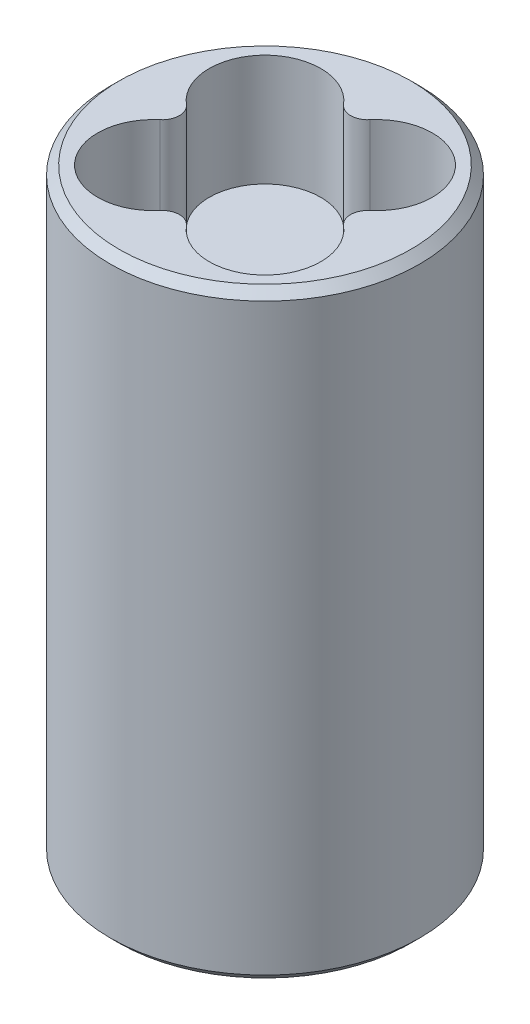
ISO-10303-21;
HEADER;
FILE_DESCRIPTION(('STEP AP214'),'2;1');
FILE_NAME('part.step','',(''),(''),'','','');
FILE_SCHEMA(('AUTOMOTIVE_DESIGN { 1 0 10303 214 1 1 1 1 }'));
ENDSEC;
DATA;
#1=APPLICATION_CONTEXT('core data for automotive mechanical design processes');
#2=APPLICATION_PROTOCOL_DEFINITION('international standard','automotive_design',2000,#1);
#3=PRODUCT_CONTEXT('',#1,'mechanical');
#4=PRODUCT('Part','Part','',(#3));
#5=PRODUCT_RELATED_PRODUCT_CATEGORY('part','',(#4));
#6=PRODUCT_DEFINITION_FORMATION('','',#4);
#7=PRODUCT_DEFINITION_CONTEXT('part definition',#1,'design');
#8=PRODUCT_DEFINITION('design','',#6,#7);
#9=PRODUCT_DEFINITION_SHAPE('','',#8);
#10=(LENGTH_UNIT() NAMED_UNIT(*) SI_UNIT(.MILLI.,.METRE.));
#11=(NAMED_UNIT(*) PLANE_ANGLE_UNIT() SI_UNIT($,.RADIAN.));
#12=(NAMED_UNIT(*) SI_UNIT($,.STERADIAN.) SOLID_ANGLE_UNIT());
#13=UNCERTAINTY_MEASURE_WITH_UNIT(LENGTH_MEASURE(1.E-05),#10,'distance_accuracy_value','');
#14=(GEOMETRIC_REPRESENTATION_CONTEXT(3) GLOBAL_UNCERTAINTY_ASSIGNED_CONTEXT((#13)) GLOBAL_UNIT_ASSIGNED_CONTEXT((#10,
#11,#12)) REPRESENTATION_CONTEXT('',''));
#15=CARTESIAN_POINT('',(0.,0.,0.));
#16=DIRECTION('',(0.,0.,1.));
#17=DIRECTION('',(1.,0.,0.));
#18=AXIS2_PLACEMENT_3D('',#15,#16,#17);
#19=CARTESIAN_POINT('',(0.,35.,0.));
#20=DIRECTION('',(0.,-1.,0.));
#21=DIRECTION('',(0.,0.,-1.));
#22=AXIS2_PLACEMENT_3D('',#19,#20,#21);
#23=CYLINDRICAL_SURFACE('',#22,9.);
#24=CARTESIAN_POINT('',(0.,0.500000000000007,0.));
#25=DIRECTION('',(0.,1.,0.));
#26=DIRECTION('',(0.,0.,1.));
#27=AXIS2_PLACEMENT_3D('',#24,#25,#26);
#28=CIRCLE('',#27,9.);
#29=CARTESIAN_POINT('',(0.,0.500000000000007,9.));
#30=VERTEX_POINT('',#29);
#31=EDGE_CURVE('E175',#30,#30,#28,.T.);
#32=ORIENTED_EDGE('',*,*,#31,.T.);
#33=EDGE_LOOP('',(#32));
#34=FACE_BOUND('',#33,.T.);
#35=CARTESIAN_POINT('',(0.,34.5,0.));
#36=DIRECTION('',(0.,1.,0.));
#37=DIRECTION('',(0.,0.,1.));
#38=AXIS2_PLACEMENT_3D('',#35,#36,#37);
#39=CIRCLE('',#38,9.);
#40=CARTESIAN_POINT('',(0.,34.5,9.));
#41=VERTEX_POINT('',#40);
#42=EDGE_CURVE('E167',#41,#41,#39,.F.);
#43=ORIENTED_EDGE('',*,*,#42,.T.);
#44=EDGE_LOOP('',(#43));
#45=FACE_BOUND('',#44,.T.);
#46=ADVANCED_FACE('F39',(#34,#45),#23,.T.);
#47=CARTESIAN_POINT('',(0.,35.,0.));
#48=DIRECTION('',(0.,1.,0.));
#49=DIRECTION('',(0.,0.,1.));
#50=AXIS2_PLACEMENT_3D('',#47,#48,#49);
#51=PLANE('',#50);
#52=CARTESIAN_POINT('',(0.,35.,0.));
#53=DIRECTION('',(0.,1.,0.));
#54=DIRECTION('',(0.,0.,1.));
#55=AXIS2_PLACEMENT_3D('',#52,#53,#54);
#56=CIRCLE('',#55,8.49999999999999);
#57=CARTESIAN_POINT('',(0.,35.,8.49999999999999));
#58=VERTEX_POINT('',#57);
#59=EDGE_CURVE('E11',#58,#58,#56,.T.);
#60=ORIENTED_EDGE('',*,*,#59,.T.);
#61=EDGE_LOOP('',(#60));
#62=FACE_BOUND('',#61,.T.);
#63=CARTESIAN_POINT('',(-3.25,35.,3.25));
#64=DIRECTION('',(0.,1.,0.));
#65=DIRECTION('',(0.,0.,1.));
#66=AXIS2_PLACEMENT_3D('',#63,#64,#65);
#67=CIRCLE('',#66,3.25);
#68=CARTESIAN_POINT('',(-5.34423330810799,35.,0.764705882352942));
#69=VERTEX_POINT('',#68);
#70=CARTESIAN_POINT('',(-0.764705882352939,35.,5.34423330810799));
#71=VERTEX_POINT('',#70);
#72=EDGE_CURVE('E191',#69,#71,#67,.T.);
#73=ORIENTED_EDGE('',*,*,#72,.F.);
#74=CARTESIAN_POINT('',(-5.98861278752583,35.,0.));
#75=DIRECTION('',(0.,1.,0.));
#76=DIRECTION('',(0.,0.,1.));
#77=AXIS2_PLACEMENT_3D('',#74,#75,#76);
#78=CIRCLE('',#77,1.);
#79=CARTESIAN_POINT('',(-5.34423330810799,35.,-0.76470588235294));
#80=VERTEX_POINT('',#79);
#81=EDGE_CURVE('E105',#69,#80,#78,.T.);
#82=ORIENTED_EDGE('',*,*,#81,.T.);
#83=CARTESIAN_POINT('',(-3.25,35.,-3.25));
#84=DIRECTION('',(0.,1.,0.));
#85=DIRECTION('',(0.,0.,1.));
#86=AXIS2_PLACEMENT_3D('',#83,#84,#85);
#87=CIRCLE('',#86,3.25);
#88=CARTESIAN_POINT('',(-0.76470588235294,35.,-5.34423330810799));
#89=VERTEX_POINT('',#88);
#90=EDGE_CURVE('E188',#89,#80,#87,.T.);
#91=ORIENTED_EDGE('',*,*,#90,.F.);
#92=CARTESIAN_POINT('',(0.,35.,-5.98861278752583));
#93=DIRECTION('',(0.,1.,0.));
#94=DIRECTION('',(0.,0.,1.));
#95=AXIS2_PLACEMENT_3D('',#92,#93,#94);
#96=CIRCLE('',#95,1.);
#97=CARTESIAN_POINT('',(0.76470588235294,35.,-5.34423330810799));
#98=VERTEX_POINT('',#97);
#99=EDGE_CURVE('E215',#89,#98,#96,.T.);
#100=ORIENTED_EDGE('',*,*,#99,.T.);
#101=CARTESIAN_POINT('',(3.25,35.,-3.25));
#102=DIRECTION('',(0.,1.,0.));
#103=DIRECTION('',(0.,0.,1.));
#104=AXIS2_PLACEMENT_3D('',#101,#102,#103);
#105=CIRCLE('',#104,3.25);
#106=CARTESIAN_POINT('',(5.34423330810799,35.,-0.76470588235294));
#107=VERTEX_POINT('',#106);
#108=EDGE_CURVE('E197',#107,#98,#105,.T.);
#109=ORIENTED_EDGE('',*,*,#108,.F.);
#110=CARTESIAN_POINT('',(5.98861278752583,35.,0.));
#111=DIRECTION('',(0.,1.,0.));
#112=DIRECTION('',(0.,0.,1.));
#113=AXIS2_PLACEMENT_3D('',#110,#111,#112);
#114=CIRCLE('',#113,1.);
#115=CARTESIAN_POINT('',(5.34423330810799,35.,0.764705882352939));
#116=VERTEX_POINT('',#115);
#117=EDGE_CURVE('E217',#107,#116,#114,.T.);
#118=ORIENTED_EDGE('',*,*,#117,.T.);
#119=CARTESIAN_POINT('',(3.25,35.,3.24999999999999));
#120=DIRECTION('',(0.,1.,0.));
#121=DIRECTION('',(0.,0.,1.));
#122=AXIS2_PLACEMENT_3D('',#119,#120,#121);
#123=CIRCLE('',#122,3.25);
#124=CARTESIAN_POINT('',(0.764705882352941,35.,5.34423330810799));
#125=VERTEX_POINT('',#124);
#126=EDGE_CURVE('E208',#125,#116,#123,.T.);
#127=ORIENTED_EDGE('',*,*,#126,.F.);
#128=CARTESIAN_POINT('',(0.,35.,5.98861278752583));
#129=DIRECTION('',(0.,1.,0.));
#130=DIRECTION('',(0.,0.,1.));
#131=AXIS2_PLACEMENT_3D('',#128,#129,#130);
#132=CIRCLE('',#131,1.);
#133=EDGE_CURVE('E219',#125,#71,#132,.T.);
#134=ORIENTED_EDGE('',*,*,#133,.T.);
#135=EDGE_LOOP('',(#73,#82,#91,#100,#109,#118,#127,#134));
#136=FACE_BOUND('',#135,.T.);
#137=ADVANCED_FACE('F127',(#62,#136),#51,.T.);
#138=CARTESIAN_POINT('',(0.,0.,0.));
#139=DIRECTION('',(0.,1.,0.));
#140=DIRECTION('',(0.,0.,1.));
#141=AXIS2_PLACEMENT_3D('',#138,#139,#140);
#142=PLANE('',#141);
#143=CARTESIAN_POINT('',(0.,0.,0.));
#144=DIRECTION('',(0.,1.,0.));
#145=DIRECTION('',(0.,0.,1.));
#146=AXIS2_PLACEMENT_3D('',#143,#144,#145);
#147=CIRCLE('',#146,8.49999999999999);
#148=CARTESIAN_POINT('',(0.,0.,8.49999999999999));
#149=VERTEX_POINT('',#148);
#150=EDGE_CURVE('E49',#149,#149,#147,.F.);
#151=ORIENTED_EDGE('',*,*,#150,.T.);
#152=EDGE_LOOP('',(#151));
#153=FACE_BOUND('',#152,.T.);
#154=CARTESIAN_POINT('',(0.,0.,0.));
#155=DIRECTION('',(0.,-1.,0.));
#156=DIRECTION('',(0.,0.,-1.));
#157=AXIS2_PLACEMENT_3D('',#154,#155,#156);
#158=CIRCLE('',#157,3.05);
#159=CARTESIAN_POINT('',(0.,0.,-3.05));
#160=VERTEX_POINT('',#159);
#161=EDGE_CURVE('E186',#160,#160,#158,.T.);
#162=ORIENTED_EDGE('',*,*,#161,.F.);
#163=EDGE_LOOP('',(#162));
#164=FACE_BOUND('',#163,.T.);
#165=ADVANCED_FACE('F133',(#153,#164),#142,.F.);
#166=CARTESIAN_POINT('',(-3.25,28.5,-3.25));
#167=DIRECTION('',(0.,1.,0.));
#168=DIRECTION('',(0.,0.,1.));
#169=AXIS2_PLACEMENT_3D('',#166,#167,#168);
#170=CYLINDRICAL_SURFACE('',#169,3.25);
#171=ORIENTED_EDGE('',*,*,#90,.T.);
#172=DIRECTION('',(0.,1.,0.));
#173=VECTOR('',#172,1.);
#174=CARTESIAN_POINT('',(-5.34423330810799,28.5,-0.76470588235294));
#175=LINE('',#174,#173);
#176=CARTESIAN_POINT('',(-5.34423330810799,28.5,-0.76470588235294));
#177=VERTEX_POINT('',#176);
#178=EDGE_CURVE('E223',#80,#177,#175,.F.);
#179=ORIENTED_EDGE('',*,*,#178,.T.);
#180=CARTESIAN_POINT('',(-3.25,28.5,-3.25));
#181=DIRECTION('',(0.,1.,0.));
#182=DIRECTION('',(0.,0.,1.));
#183=AXIS2_PLACEMENT_3D('',#180,#181,#182);
#184=CIRCLE('',#183,3.25);
#185=CARTESIAN_POINT('',(-0.76470588235294,28.5,-5.34423330810799));
#186=VERTEX_POINT('',#185);
#187=EDGE_CURVE('E194',#186,#177,#184,.T.);
#188=ORIENTED_EDGE('',*,*,#187,.F.);
#189=DIRECTION('',(0.,1.,0.));
#190=VECTOR('',#189,1.);
#191=CARTESIAN_POINT('',(-0.76470588235294,28.5,-5.34423330810799));
#192=LINE('',#191,#190);
#193=EDGE_CURVE('E159',#186,#89,#192,.T.);
#194=ORIENTED_EDGE('',*,*,#193,.T.);
#195=EDGE_LOOP('',(#171,#179,#188,#194));
#196=FACE_BOUND('',#195,.T.);
#197=ADVANCED_FACE('F183',(#196),#170,.F.);
#198=CARTESIAN_POINT('',(3.25,28.5,-3.25));
#199=DIRECTION('',(0.,1.,0.));
#200=DIRECTION('',(0.,0.,1.));
#201=AXIS2_PLACEMENT_3D('',#198,#199,#200);
#202=CYLINDRICAL_SURFACE('',#201,3.25);
#203=CARTESIAN_POINT('',(3.25,28.5,-3.25));
#204=DIRECTION('',(0.,1.,0.));
#205=DIRECTION('',(0.,0.,1.));
#206=AXIS2_PLACEMENT_3D('',#203,#204,#205);
#207=CIRCLE('',#206,3.25);
#208=CARTESIAN_POINT('',(5.34423330810799,28.5,-0.76470588235294));
#209=VERTEX_POINT('',#208);
#210=CARTESIAN_POINT('',(0.76470588235294,28.5,-5.34423330810799));
#211=VERTEX_POINT('',#210);
#212=EDGE_CURVE('E203',#209,#211,#207,.T.);
#213=ORIENTED_EDGE('',*,*,#212,.F.);
#214=DIRECTION('',(0.,1.,0.));
#215=VECTOR('',#214,1.);
#216=CARTESIAN_POINT('',(5.34423330810799,28.5,-0.76470588235294));
#217=LINE('',#216,#215);
#218=EDGE_CURVE('E231',#209,#107,#217,.T.);
#219=ORIENTED_EDGE('',*,*,#218,.T.);
#220=ORIENTED_EDGE('',*,*,#108,.T.);
#221=DIRECTION('',(0.,1.,0.));
#222=VECTOR('',#221,1.);
#223=CARTESIAN_POINT('',(0.764705882352941,28.5,-5.34423330810799));
#224=LINE('',#223,#222);
#225=EDGE_CURVE('E56',#98,#211,#224,.F.);
#226=ORIENTED_EDGE('',*,*,#225,.T.);
#227=EDGE_LOOP('',(#213,#219,#220,#226));
#228=FACE_BOUND('',#227,.T.);
#229=ADVANCED_FACE('F253',(#228),#202,.F.);
#230=CARTESIAN_POINT('',(3.25,28.5,3.24999999999999));
#231=DIRECTION('',(0.,1.,0.));
#232=DIRECTION('',(0.,0.,1.));
#233=AXIS2_PLACEMENT_3D('',#230,#231,#232);
#234=CYLINDRICAL_SURFACE('',#233,3.25);
#235=CARTESIAN_POINT('',(3.25,28.5,3.24999999999999));
#236=DIRECTION('',(0.,1.,0.));
#237=DIRECTION('',(0.,0.,1.));
#238=AXIS2_PLACEMENT_3D('',#235,#236,#237);
#239=CIRCLE('',#238,3.25);
#240=CARTESIAN_POINT('',(0.764705882352941,28.5,5.34423330810799));
#241=VERTEX_POINT('',#240);
#242=CARTESIAN_POINT('',(5.34423330810799,28.5,0.764705882352939));
#243=VERTEX_POINT('',#242);
#244=EDGE_CURVE('E200',#241,#243,#239,.T.);
#245=ORIENTED_EDGE('',*,*,#244,.F.);
#246=DIRECTION('',(0.,1.,0.));
#247=VECTOR('',#246,1.);
#248=CARTESIAN_POINT('',(0.764705882352941,28.5,5.34423330810799));
#249=LINE('',#248,#247);
#250=EDGE_CURVE('E227',#241,#125,#249,.T.);
#251=ORIENTED_EDGE('',*,*,#250,.T.);
#252=ORIENTED_EDGE('',*,*,#126,.T.);
#253=DIRECTION('',(0.,1.,0.));
#254=VECTOR('',#253,1.);
#255=CARTESIAN_POINT('',(5.34423330810799,28.5,0.764705882352939));
#256=LINE('',#255,#254);
#257=EDGE_CURVE('E225',#116,#243,#256,.F.);
#258=ORIENTED_EDGE('',*,*,#257,.T.);
#259=EDGE_LOOP('',(#245,#251,#252,#258));
#260=FACE_BOUND('',#259,.T.);
#261=ADVANCED_FACE('F242',(#260),#234,.F.);
#262=CARTESIAN_POINT('',(-3.25,28.5,3.25));
#263=DIRECTION('',(0.,1.,0.));
#264=DIRECTION('',(0.,0.,1.));
#265=AXIS2_PLACEMENT_3D('',#262,#263,#264);
#266=CYLINDRICAL_SURFACE('',#265,3.25);
#267=CARTESIAN_POINT('',(-3.25,28.5,3.25));
#268=DIRECTION('',(0.,1.,0.));
#269=DIRECTION('',(0.,0.,1.));
#270=AXIS2_PLACEMENT_3D('',#267,#268,#269);
#271=CIRCLE('',#270,3.25);
#272=CARTESIAN_POINT('',(-5.34423330810799,28.5,0.764705882352942));
#273=VERTEX_POINT('',#272);
#274=CARTESIAN_POINT('',(-0.764705882352939,28.5,5.34423330810799));
#275=VERTEX_POINT('',#274);
#276=EDGE_CURVE('E196',#273,#275,#271,.T.);
#277=ORIENTED_EDGE('',*,*,#276,.F.);
#278=DIRECTION('',(0.,1.,0.));
#279=VECTOR('',#278,1.);
#280=CARTESIAN_POINT('',(-5.34423330810799,28.5,0.764705882352942));
#281=LINE('',#280,#279);
#282=EDGE_CURVE('E213',#273,#69,#281,.T.);
#283=ORIENTED_EDGE('',*,*,#282,.T.);
#284=ORIENTED_EDGE('',*,*,#72,.T.);
#285=DIRECTION('',(0.,1.,0.));
#286=VECTOR('',#285,1.);
#287=CARTESIAN_POINT('',(-0.764705882352939,28.5,5.34423330810799));
#288=LINE('',#287,#286);
#289=EDGE_CURVE('E204',#71,#275,#288,.F.);
#290=ORIENTED_EDGE('',*,*,#289,.T.);
#291=EDGE_LOOP('',(#277,#283,#284,#290));
#292=FACE_BOUND('',#291,.T.);
#293=ADVANCED_FACE('F248',(#292),#266,.F.);
#294=CARTESIAN_POINT('',(0.,28.5,0.));
#295=DIRECTION('',(0.,1.,0.));
#296=DIRECTION('',(0.,0.,1.));
#297=AXIS2_PLACEMENT_3D('',#294,#295,#296);
#298=PLANE('',#297);
#299=ORIENTED_EDGE('',*,*,#212,.T.);
#300=CARTESIAN_POINT('',(0.,28.5,-5.98861278752583));
#301=DIRECTION('',(0.,1.,0.));
#302=DIRECTION('',(0.,0.,1.));
#303=AXIS2_PLACEMENT_3D('',#300,#301,#302);
#304=CIRCLE('',#303,1.);
#305=EDGE_CURVE('E157',#211,#186,#304,.F.);
#306=ORIENTED_EDGE('',*,*,#305,.T.);
#307=ORIENTED_EDGE('',*,*,#187,.T.);
#308=CARTESIAN_POINT('',(-5.98861278752583,28.5,0.));
#309=DIRECTION('',(0.,1.,0.));
#310=DIRECTION('',(0.,0.,1.));
#311=AXIS2_PLACEMENT_3D('',#308,#309,#310);
#312=CIRCLE('',#311,1.);
#313=EDGE_CURVE('E234',#177,#273,#312,.F.);
#314=ORIENTED_EDGE('',*,*,#313,.T.);
#315=ORIENTED_EDGE('',*,*,#276,.T.);
#316=CARTESIAN_POINT('',(0.,28.5,5.98861278752583));
#317=DIRECTION('',(0.,1.,0.));
#318=DIRECTION('',(0.,0.,1.));
#319=AXIS2_PLACEMENT_3D('',#316,#317,#318);
#320=CIRCLE('',#319,1.);
#321=EDGE_CURVE('E169',#275,#241,#320,.F.);
#322=ORIENTED_EDGE('',*,*,#321,.T.);
#323=ORIENTED_EDGE('',*,*,#244,.T.);
#324=CARTESIAN_POINT('',(5.98861278752583,28.5,0.));
#325=DIRECTION('',(0.,1.,0.));
#326=DIRECTION('',(0.,0.,1.));
#327=AXIS2_PLACEMENT_3D('',#324,#325,#326);
#328=CIRCLE('',#327,1.);
#329=EDGE_CURVE('E164',#243,#209,#328,.F.);
#330=ORIENTED_EDGE('',*,*,#329,.T.);
#331=EDGE_LOOP('',(#299,#306,#307,#314,#315,#322,#323,#330));
#332=FACE_BOUND('',#331,.T.);
#333=ADVANCED_FACE('F144',(#332),#298,.T.);
#334=CARTESIAN_POINT('',(-5.98861278752583,28.5,0.));
#335=DIRECTION('',(0.,1.,0.));
#336=DIRECTION('',(0.,0.,1.));
#337=AXIS2_PLACEMENT_3D('',#334,#335,#336);
#338=CYLINDRICAL_SURFACE('',#337,1.);
#339=ORIENTED_EDGE('',*,*,#313,.F.);
#340=ORIENTED_EDGE('',*,*,#178,.F.);
#341=ORIENTED_EDGE('',*,*,#81,.F.);
#342=ORIENTED_EDGE('',*,*,#282,.F.);
#343=EDGE_LOOP('',(#339,#340,#341,#342));
#344=FACE_BOUND('',#343,.T.);
#345=ADVANCED_FACE('F140',(#344),#338,.T.);
#346=CARTESIAN_POINT('',(0.,28.5,5.98861278752583));
#347=DIRECTION('',(0.,1.,0.));
#348=DIRECTION('',(0.,0.,1.));
#349=AXIS2_PLACEMENT_3D('',#346,#347,#348);
#350=CYLINDRICAL_SURFACE('',#349,1.);
#351=ORIENTED_EDGE('',*,*,#321,.F.);
#352=ORIENTED_EDGE('',*,*,#289,.F.);
#353=ORIENTED_EDGE('',*,*,#133,.F.);
#354=ORIENTED_EDGE('',*,*,#250,.F.);
#355=EDGE_LOOP('',(#351,#352,#353,#354));
#356=FACE_BOUND('',#355,.T.);
#357=ADVANCED_FACE('F143',(#356),#350,.T.);
#358=CARTESIAN_POINT('',(5.98861278752583,28.5,0.));
#359=DIRECTION('',(0.,1.,0.));
#360=DIRECTION('',(0.,0.,1.));
#361=AXIS2_PLACEMENT_3D('',#358,#359,#360);
#362=CYLINDRICAL_SURFACE('',#361,1.);
#363=ORIENTED_EDGE('',*,*,#329,.F.);
#364=ORIENTED_EDGE('',*,*,#257,.F.);
#365=ORIENTED_EDGE('',*,*,#117,.F.);
#366=ORIENTED_EDGE('',*,*,#218,.F.);
#367=EDGE_LOOP('',(#363,#364,#365,#366));
#368=FACE_BOUND('',#367,.T.);
#369=ADVANCED_FACE('F147',(#368),#362,.T.);
#370=CARTESIAN_POINT('',(0.,28.5,-5.98861278752583));
#371=DIRECTION('',(0.,1.,0.));
#372=DIRECTION('',(0.,0.,1.));
#373=AXIS2_PLACEMENT_3D('',#370,#371,#372);
#374=CYLINDRICAL_SURFACE('',#373,1.);
#375=ORIENTED_EDGE('',*,*,#305,.F.);
#376=ORIENTED_EDGE('',*,*,#225,.F.);
#377=ORIENTED_EDGE('',*,*,#99,.F.);
#378=ORIENTED_EDGE('',*,*,#193,.F.);
#379=EDGE_LOOP('',(#375,#376,#377,#378));
#380=FACE_BOUND('',#379,.T.);
#381=ADVANCED_FACE('F120',(#380),#374,.T.);
#382=CARTESIAN_POINT('',(0.,7.,0.));
#383=DIRECTION('',(0.,-1.,0.));
#384=DIRECTION('',(0.,0.,-1.));
#385=AXIS2_PLACEMENT_3D('',#382,#383,#384);
#386=CYLINDRICAL_SURFACE('',#385,3.05);
#387=CARTESIAN_POINT('',(0.,3.95000000000001,0.));
#388=DIRECTION('',(0.,-1.,0.));
#389=DIRECTION('',(0.,0.,-1.));
#390=AXIS2_PLACEMENT_3D('',#387,#388,#389);
#391=CIRCLE('',#390,3.05);
#392=CARTESIAN_POINT('',(0.,3.95000000000001,-3.05));
#393=VERTEX_POINT('',#392);
#394=EDGE_CURVE('E163',#393,#393,#391,.F.);
#395=ORIENTED_EDGE('',*,*,#394,.T.);
#396=EDGE_LOOP('',(#395));
#397=FACE_BOUND('',#396,.T.);
#398=ORIENTED_EDGE('',*,*,#161,.T.);
#399=EDGE_LOOP('',(#398));
#400=FACE_BOUND('',#399,.T.);
#401=ADVANCED_FACE('F112',(#397,#400),#386,.F.);
#402=CARTESIAN_POINT('',(0.,3.95000000000001,0.));
#403=DIRECTION('',(0.,-1.,0.));
#404=DIRECTION('',(0.,0.,-1.));
#405=AXIS2_PLACEMENT_3D('',#402,#403,#404);
#406=CONICAL_SURFACE('',#405,3.05000000000003,0.785398163397455);
#407=ORIENTED_EDGE('',*,*,#394,.F.);
#408=EDGE_LOOP('',(#407));
#409=FACE_BOUND('',#408,.T.);
#410=CARTESIAN_POINT('',(0.,7.,0.));
#411=VERTEX_POINT('',#410);
#412=VERTEX_LOOP('',#411);
#413=FACE_BOUND('',#412,.T.);
#414=ADVANCED_FACE('F109',(#409,#413),#406,.F.);
#415=CARTESIAN_POINT('',(0.,0.500000000000007,0.));
#416=DIRECTION('',(0.,1.,0.));
#417=DIRECTION('',(0.,0.,1.));
#418=AXIS2_PLACEMENT_3D('',#415,#416,#417);
#419=CONICAL_SURFACE('',#418,9.,0.78539816339745);
#420=ORIENTED_EDGE('',*,*,#150,.F.);
#421=EDGE_LOOP('',(#420));
#422=FACE_BOUND('',#421,.T.);
#423=ORIENTED_EDGE('',*,*,#31,.F.);
#424=EDGE_LOOP('',(#423));
#425=FACE_BOUND('',#424,.T.);
#426=ADVANCED_FACE('F111',(#422,#425),#419,.T.);
#427=CARTESIAN_POINT('',(0.,35.,0.));
#428=DIRECTION('',(0.,-1.,0.));
#429=DIRECTION('',(0.,0.,-1.));
#430=AXIS2_PLACEMENT_3D('',#427,#428,#429);
#431=CONICAL_SURFACE('',#430,8.49999999999999,0.785398163397447);
#432=ORIENTED_EDGE('',*,*,#42,.F.);
#433=EDGE_LOOP('',(#432));
#434=FACE_BOUND('',#433,.T.);
#435=ORIENTED_EDGE('',*,*,#59,.F.);
#436=EDGE_LOOP('',(#435));
#437=FACE_BOUND('',#436,.T.);
#438=ADVANCED_FACE('F42',(#434,#437),#431,.T.);
#439=CLOSED_SHELL('',(#46,#137,#165,#197,#229,#261,#293,#333,#345,#357,#369,#381,#401,#414,#426,#438));
#440=MANIFOLD_SOLID_BREP('B2',#439);
#441=ADVANCED_BREP_SHAPE_REPRESENTATION('',(#18,#440),#14);
#442=SHAPE_DEFINITION_REPRESENTATION(#9,#441);
ENDSEC;
END-ISO-10303-21;
